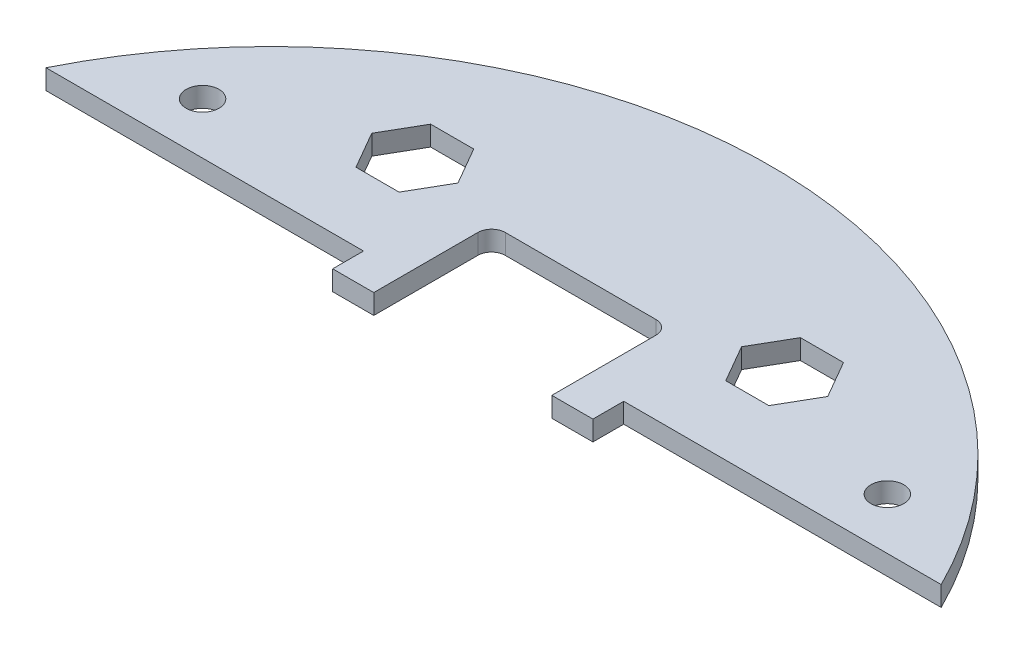
ISO-10303-21;
HEADER;
FILE_DESCRIPTION(('STEP AP214'),'2;1');
FILE_NAME('part.step','',(''),(''),'','','');
FILE_SCHEMA(('AUTOMOTIVE_DESIGN { 1 0 10303 214 1 1 1 1 }'));
ENDSEC;
DATA;
#1=APPLICATION_CONTEXT('core data for automotive mechanical design processes');
#2=APPLICATION_PROTOCOL_DEFINITION('international standard','automotive_design',2000,#1);
#3=PRODUCT_CONTEXT('',#1,'mechanical');
#4=PRODUCT('Part','Part','',(#3));
#5=PRODUCT_RELATED_PRODUCT_CATEGORY('part','',(#4));
#6=PRODUCT_DEFINITION_FORMATION('','',#4);
#7=PRODUCT_DEFINITION_CONTEXT('part definition',#1,'design');
#8=PRODUCT_DEFINITION('design','',#6,#7);
#9=PRODUCT_DEFINITION_SHAPE('','',#8);
#10=(LENGTH_UNIT() NAMED_UNIT(*) SI_UNIT(.MILLI.,.METRE.));
#11=(NAMED_UNIT(*) PLANE_ANGLE_UNIT() SI_UNIT($,.RADIAN.));
#12=(NAMED_UNIT(*) SI_UNIT($,.STERADIAN.) SOLID_ANGLE_UNIT());
#13=UNCERTAINTY_MEASURE_WITH_UNIT(LENGTH_MEASURE(1.E-05),#10,'distance_accuracy_value','');
#14=(GEOMETRIC_REPRESENTATION_CONTEXT(3) GLOBAL_UNCERTAINTY_ASSIGNED_CONTEXT((#13)) GLOBAL_UNIT_ASSIGNED_CONTEXT((#10,
#11,#12)) REPRESENTATION_CONTEXT('',''));
#15=CARTESIAN_POINT('',(0.,0.,0.));
#16=DIRECTION('',(0.,0.,1.));
#17=DIRECTION('',(1.,0.,0.));
#18=AXIS2_PLACEMENT_3D('',#15,#16,#17);
#19=CARTESIAN_POINT('',(-30.1465589670835,0.,-42.55));
#20=DIRECTION('',(0.,0.,1.));
#21=DIRECTION('',(1.,0.,0.));
#22=AXIS2_PLACEMENT_3D('',#19,#20,#21);
#23=PLANE('',#22);
#24=DIRECTION('',(1.,0.,0.));
#25=VECTOR('',#24,1.);
#26=CARTESIAN_POINT('',(-30.1465589670835,2.9,-42.55));
#27=LINE('',#26,#25);
#28=CARTESIAN_POINT('',(-30.1465589670835,2.9,-42.55));
#29=VERTEX_POINT('',#28);
#30=CARTESIAN_POINT('',(-23.8534410329165,2.9,-42.55));
#31=VERTEX_POINT('',#30);
#32=EDGE_CURVE('E301',#29,#31,#27,.T.);
#33=ORIENTED_EDGE('',*,*,#32,.T.);
#34=DIRECTION('',(0.,1.,0.));
#35=VECTOR('',#34,1.);
#36=CARTESIAN_POINT('',(-23.8534410329165,0.,-42.55));
#37=LINE('',#36,#35);
#38=CARTESIAN_POINT('',(-23.8534410329165,0.,-42.55));
#39=VERTEX_POINT('',#38);
#40=EDGE_CURVE('E332',#39,#31,#37,.T.);
#41=ORIENTED_EDGE('',*,*,#40,.F.);
#42=DIRECTION('',(1.,0.,0.));
#43=VECTOR('',#42,1.);
#44=CARTESIAN_POINT('',(-30.1465589670835,0.,-42.55));
#45=LINE('',#44,#43);
#46=CARTESIAN_POINT('',(-30.1465589670835,0.,-42.55));
#47=VERTEX_POINT('',#46);
#48=EDGE_CURVE('E313',#47,#39,#45,.T.);
#49=ORIENTED_EDGE('',*,*,#48,.F.);
#50=DIRECTION('',(0.,1.,0.));
#51=VECTOR('',#50,1.);
#52=CARTESIAN_POINT('',(-30.1465589670835,0.,-42.55));
#53=LINE('',#52,#51);
#54=EDGE_CURVE('E335',#47,#29,#53,.T.);
#55=ORIENTED_EDGE('',*,*,#54,.T.);
#56=EDGE_LOOP('',(#33,#41,#49,#55));
#57=FACE_BOUND('',#56,.T.);
#58=ADVANCED_FACE('F33',(#57),#23,.F.);
#59=CARTESIAN_POINT('',(-33.2931179341669,0.,-48.));
#60=DIRECTION('',(-0.866025403784439,0.,0.499999999999999));
#61=DIRECTION('',(0.499999999999999,0.,0.866025403784439));
#62=AXIS2_PLACEMENT_3D('',#59,#60,#61);
#63=PLANE('',#62);
#64=DIRECTION('',(0.499999999999999,0.,0.866025403784439));
#65=VECTOR('',#64,1.);
#66=CARTESIAN_POINT('',(-33.2931179341669,2.9,-48.));
#67=LINE('',#66,#65);
#68=CARTESIAN_POINT('',(-33.2931179341669,2.9,-48.));
#69=VERTEX_POINT('',#68);
#70=EDGE_CURVE('E327',#69,#29,#67,.T.);
#71=ORIENTED_EDGE('',*,*,#70,.T.);
#72=ORIENTED_EDGE('',*,*,#54,.F.);
#73=DIRECTION('',(0.499999999999999,0.,0.866025403784439));
#74=VECTOR('',#73,1.);
#75=CARTESIAN_POINT('',(-33.2931179341669,0.,-48.));
#76=LINE('',#75,#74);
#77=CARTESIAN_POINT('',(-33.2931179341669,0.,-48.));
#78=VERTEX_POINT('',#77);
#79=EDGE_CURVE('E310',#78,#47,#76,.T.);
#80=ORIENTED_EDGE('',*,*,#79,.F.);
#81=DIRECTION('',(0.,1.,0.));
#82=VECTOR('',#81,1.);
#83=CARTESIAN_POINT('',(-33.2931179341669,0.,-48.));
#84=LINE('',#83,#82);
#85=EDGE_CURVE('E337',#78,#69,#84,.T.);
#86=ORIENTED_EDGE('',*,*,#85,.T.);
#87=EDGE_LOOP('',(#71,#72,#80,#86));
#88=FACE_BOUND('',#87,.T.);
#89=ADVANCED_FACE('F444',(#88),#63,.F.);
#90=CARTESIAN_POINT('',(-30.1465589670834,0.,-53.45));
#91=DIRECTION('',(-0.866025403784439,0.,-0.5));
#92=DIRECTION('',(-0.5,0.,0.866025403784439));
#93=AXIS2_PLACEMENT_3D('',#90,#91,#92);
#94=PLANE('',#93);
#95=DIRECTION('',(-0.5,0.,0.866025403784439));
#96=VECTOR('',#95,1.);
#97=CARTESIAN_POINT('',(-30.1465589670834,2.9,-53.45));
#98=LINE('',#97,#96);
#99=CARTESIAN_POINT('',(-30.1465589670834,2.9,-53.45));
#100=VERTEX_POINT('',#99);
#101=EDGE_CURVE('E324',#100,#69,#98,.T.);
#102=ORIENTED_EDGE('',*,*,#101,.T.);
#103=ORIENTED_EDGE('',*,*,#85,.F.);
#104=DIRECTION('',(-0.5,0.,0.866025403784439));
#105=VECTOR('',#104,1.);
#106=CARTESIAN_POINT('',(-30.1465589670834,0.,-53.45));
#107=LINE('',#106,#105);
#108=CARTESIAN_POINT('',(-30.1465589670834,0.,-53.45));
#109=VERTEX_POINT('',#108);
#110=EDGE_CURVE('E307',#109,#78,#107,.T.);
#111=ORIENTED_EDGE('',*,*,#110,.F.);
#112=DIRECTION('',(0.,1.,0.));
#113=VECTOR('',#112,1.);
#114=CARTESIAN_POINT('',(-30.1465589670834,0.,-53.45));
#115=LINE('',#114,#113);
#116=EDGE_CURVE('E339',#109,#100,#115,.T.);
#117=ORIENTED_EDGE('',*,*,#116,.T.);
#118=EDGE_LOOP('',(#102,#103,#111,#117));
#119=FACE_BOUND('',#118,.T.);
#120=ADVANCED_FACE('F450',(#119),#94,.F.);
#121=CARTESIAN_POINT('',(-23.8534410329165,0.,-53.45));
#122=DIRECTION('',(0.,0.,-1.));
#123=DIRECTION('',(-1.,0.,0.));
#124=AXIS2_PLACEMENT_3D('',#121,#122,#123);
#125=PLANE('',#124);
#126=DIRECTION('',(-1.,0.,0.));
#127=VECTOR('',#126,1.);
#128=CARTESIAN_POINT('',(-23.8534410329165,2.9,-53.45));
#129=LINE('',#128,#127);
#130=CARTESIAN_POINT('',(-23.8534410329165,2.9,-53.45));
#131=VERTEX_POINT('',#130);
#132=EDGE_CURVE('E321',#131,#100,#129,.T.);
#133=ORIENTED_EDGE('',*,*,#132,.T.);
#134=ORIENTED_EDGE('',*,*,#116,.F.);
#135=DIRECTION('',(-1.,0.,0.));
#136=VECTOR('',#135,1.);
#137=CARTESIAN_POINT('',(-23.8534410329165,0.,-53.45));
#138=LINE('',#137,#136);
#139=CARTESIAN_POINT('',(-23.8534410329165,0.,-53.45));
#140=VERTEX_POINT('',#139);
#141=EDGE_CURVE('E304',#140,#109,#138,.T.);
#142=ORIENTED_EDGE('',*,*,#141,.F.);
#143=DIRECTION('',(0.,1.,0.));
#144=VECTOR('',#143,1.);
#145=CARTESIAN_POINT('',(-23.8534410329165,0.,-53.45));
#146=LINE('',#145,#144);
#147=EDGE_CURVE('E341',#140,#131,#146,.T.);
#148=ORIENTED_EDGE('',*,*,#147,.T.);
#149=EDGE_LOOP('',(#133,#134,#142,#148));
#150=FACE_BOUND('',#149,.T.);
#151=ADVANCED_FACE('F459',(#150),#125,.F.);
#152=CARTESIAN_POINT('',(-20.7068820658331,0.,-48.));
#153=DIRECTION('',(0.866025403784439,0.,-0.5));
#154=DIRECTION('',(-0.5,0.,-0.866025403784439));
#155=AXIS2_PLACEMENT_3D('',#152,#153,#154);
#156=PLANE('',#155);
#157=DIRECTION('',(-0.5,0.,-0.866025403784439));
#158=VECTOR('',#157,1.);
#159=CARTESIAN_POINT('',(-20.7068820658331,2.9,-48.));
#160=LINE('',#159,#158);
#161=CARTESIAN_POINT('',(-20.7068820658331,2.9,-48.));
#162=VERTEX_POINT('',#161);
#163=EDGE_CURVE('E318',#162,#131,#160,.T.);
#164=ORIENTED_EDGE('',*,*,#163,.T.);
#165=ORIENTED_EDGE('',*,*,#147,.F.);
#166=DIRECTION('',(-0.5,0.,-0.866025403784439));
#167=VECTOR('',#166,1.);
#168=CARTESIAN_POINT('',(-20.7068820658331,0.,-48.));
#169=LINE('',#168,#167);
#170=CARTESIAN_POINT('',(-20.7068820658331,0.,-48.));
#171=VERTEX_POINT('',#170);
#172=EDGE_CURVE('E300',#171,#140,#169,.T.);
#173=ORIENTED_EDGE('',*,*,#172,.F.);
#174=DIRECTION('',(0.,1.,0.));
#175=VECTOR('',#174,1.);
#176=CARTESIAN_POINT('',(-20.7068820658331,0.,-48.));
#177=LINE('',#176,#175);
#178=EDGE_CURVE('E316',#171,#162,#177,.T.);
#179=ORIENTED_EDGE('',*,*,#178,.T.);
#180=EDGE_LOOP('',(#164,#165,#173,#179));
#181=FACE_BOUND('',#180,.T.);
#182=ADVANCED_FACE('F463',(#181),#156,.F.);
#183=CARTESIAN_POINT('',(-23.8534410329165,0.,-42.55));
#184=DIRECTION('',(0.866025403784439,0.,0.5));
#185=DIRECTION('',(0.5,0.,-0.866025403784439));
#186=AXIS2_PLACEMENT_3D('',#183,#184,#185);
#187=PLANE('',#186);
#188=DIRECTION('',(0.5,0.,-0.866025403784439));
#189=VECTOR('',#188,1.);
#190=CARTESIAN_POINT('',(-23.8534410329165,2.9,-42.55));
#191=LINE('',#190,#189);
#192=EDGE_CURVE('E287',#31,#162,#191,.T.);
#193=ORIENTED_EDGE('',*,*,#192,.T.);
#194=ORIENTED_EDGE('',*,*,#178,.F.);
#195=DIRECTION('',(0.5,0.,-0.866025403784439));
#196=VECTOR('',#195,1.);
#197=CARTESIAN_POINT('',(-23.8534410329165,0.,-42.55));
#198=LINE('',#197,#196);
#199=EDGE_CURVE('E297',#39,#171,#198,.T.);
#200=ORIENTED_EDGE('',*,*,#199,.F.);
#201=ORIENTED_EDGE('',*,*,#40,.T.);
#202=EDGE_LOOP('',(#193,#194,#200,#201));
#203=FACE_BOUND('',#202,.T.);
#204=ADVANCED_FACE('F467',(#203),#187,.F.);
#205=CARTESIAN_POINT('',(23.8534410329165,0.,-42.55));
#206=DIRECTION('',(-0.866025403784439,0.,0.5));
#207=DIRECTION('',(0.5,0.,0.866025403784439));
#208=AXIS2_PLACEMENT_3D('',#205,#206,#207);
#209=PLANE('',#208);
#210=DIRECTION('',(0.5,0.,0.866025403784439));
#211=VECTOR('',#210,1.);
#212=CARTESIAN_POINT('',(23.8534410329165,2.9,-42.55));
#213=LINE('',#212,#211);
#214=CARTESIAN_POINT('',(20.7068820658331,2.9,-48.));
#215=VERTEX_POINT('',#214);
#216=CARTESIAN_POINT('',(23.8534410329165,2.9,-42.55));
#217=VERTEX_POINT('',#216);
#218=EDGE_CURVE('E256',#215,#217,#213,.T.);
#219=ORIENTED_EDGE('',*,*,#218,.T.);
#220=DIRECTION('',(0.,1.,0.));
#221=VECTOR('',#220,1.);
#222=CARTESIAN_POINT('',(23.8534410329165,0.,-42.55));
#223=LINE('',#222,#221);
#224=CARTESIAN_POINT('',(23.8534410329165,0.,-42.55));
#225=VERTEX_POINT('',#224);
#226=EDGE_CURVE('E285',#225,#217,#223,.T.);
#227=ORIENTED_EDGE('',*,*,#226,.F.);
#228=DIRECTION('',(0.5,0.,0.866025403784439));
#229=VECTOR('',#228,1.);
#230=CARTESIAN_POINT('',(23.8534410329165,0.,-42.55));
#231=LINE('',#230,#229);
#232=CARTESIAN_POINT('',(20.7068820658331,0.,-48.));
#233=VERTEX_POINT('',#232);
#234=EDGE_CURVE('E266',#233,#225,#231,.T.);
#235=ORIENTED_EDGE('',*,*,#234,.F.);
#236=DIRECTION('',(0.,1.,0.));
#237=VECTOR('',#236,1.);
#238=CARTESIAN_POINT('',(20.7068820658331,0.,-48.));
#239=LINE('',#238,#237);
#240=EDGE_CURVE('E288',#233,#215,#239,.T.);
#241=ORIENTED_EDGE('',*,*,#240,.T.);
#242=EDGE_LOOP('',(#219,#227,#235,#241));
#243=FACE_BOUND('',#242,.T.);
#244=ADVANCED_FACE('F471',(#243),#209,.F.);
#245=CARTESIAN_POINT('',(20.7068820658331,0.,-48.));
#246=DIRECTION('',(-0.866025403784439,0.,-0.5));
#247=DIRECTION('',(-0.5,0.,0.866025403784439));
#248=AXIS2_PLACEMENT_3D('',#245,#246,#247);
#249=PLANE('',#248);
#250=DIRECTION('',(-0.5,0.,0.866025403784439));
#251=VECTOR('',#250,1.);
#252=CARTESIAN_POINT('',(20.7068820658331,2.9,-48.));
#253=LINE('',#252,#251);
#254=CARTESIAN_POINT('',(23.8534410329165,2.9,-53.45));
#255=VERTEX_POINT('',#254);
#256=EDGE_CURVE('E280',#255,#215,#253,.T.);
#257=ORIENTED_EDGE('',*,*,#256,.T.);
#258=ORIENTED_EDGE('',*,*,#240,.F.);
#259=DIRECTION('',(-0.5,0.,0.866025403784439));
#260=VECTOR('',#259,1.);
#261=CARTESIAN_POINT('',(20.7068820658331,0.,-48.));
#262=LINE('',#261,#260);
#263=CARTESIAN_POINT('',(23.8534410329165,0.,-53.45));
#264=VERTEX_POINT('',#263);
#265=EDGE_CURVE('E263',#264,#233,#262,.T.);
#266=ORIENTED_EDGE('',*,*,#265,.F.);
#267=DIRECTION('',(0.,1.,0.));
#268=VECTOR('',#267,1.);
#269=CARTESIAN_POINT('',(23.8534410329165,0.,-53.45));
#270=LINE('',#269,#268);
#271=EDGE_CURVE('E290',#264,#255,#270,.T.);
#272=ORIENTED_EDGE('',*,*,#271,.T.);
#273=EDGE_LOOP('',(#257,#258,#266,#272));
#274=FACE_BOUND('',#273,.T.);
#275=ADVANCED_FACE('F545',(#274),#249,.F.);
#276=CARTESIAN_POINT('',(23.8534410329165,0.,-53.45));
#277=DIRECTION('',(0.,0.,-1.));
#278=DIRECTION('',(-1.,0.,0.));
#279=AXIS2_PLACEMENT_3D('',#276,#277,#278);
#280=PLANE('',#279);
#281=DIRECTION('',(-1.,0.,0.));
#282=VECTOR('',#281,1.);
#283=CARTESIAN_POINT('',(23.8534410329165,2.9,-53.45));
#284=LINE('',#283,#282);
#285=CARTESIAN_POINT('',(30.1465589670834,2.9,-53.45));
#286=VERTEX_POINT('',#285);
#287=EDGE_CURVE('E277',#286,#255,#284,.T.);
#288=ORIENTED_EDGE('',*,*,#287,.T.);
#289=ORIENTED_EDGE('',*,*,#271,.F.);
#290=DIRECTION('',(-1.,0.,0.));
#291=VECTOR('',#290,1.);
#292=CARTESIAN_POINT('',(23.8534410329165,0.,-53.45));
#293=LINE('',#292,#291);
#294=CARTESIAN_POINT('',(30.1465589670834,0.,-53.45));
#295=VERTEX_POINT('',#294);
#296=EDGE_CURVE('E260',#295,#264,#293,.T.);
#297=ORIENTED_EDGE('',*,*,#296,.F.);
#298=DIRECTION('',(0.,1.,0.));
#299=VECTOR('',#298,1.);
#300=CARTESIAN_POINT('',(30.1465589670834,0.,-53.45));
#301=LINE('',#300,#299);
#302=EDGE_CURVE('E292',#295,#286,#301,.T.);
#303=ORIENTED_EDGE('',*,*,#302,.T.);
#304=EDGE_LOOP('',(#288,#289,#297,#303));
#305=FACE_BOUND('',#304,.T.);
#306=ADVANCED_FACE('F549',(#305),#280,.F.);
#307=CARTESIAN_POINT('',(30.1465589670834,0.,-53.45));
#308=DIRECTION('',(0.866025403784439,0.,-0.5));
#309=DIRECTION('',(-0.5,0.,-0.866025403784439));
#310=AXIS2_PLACEMENT_3D('',#307,#308,#309);
#311=PLANE('',#310);
#312=DIRECTION('',(-0.5,0.,-0.866025403784439));
#313=VECTOR('',#312,1.);
#314=CARTESIAN_POINT('',(30.1465589670834,2.9,-53.45));
#315=LINE('',#314,#313);
#316=CARTESIAN_POINT('',(33.2931179341669,2.9,-48.));
#317=VERTEX_POINT('',#316);
#318=EDGE_CURVE('E274',#317,#286,#315,.T.);
#319=ORIENTED_EDGE('',*,*,#318,.T.);
#320=ORIENTED_EDGE('',*,*,#302,.F.);
#321=DIRECTION('',(-0.5,0.,-0.866025403784439));
#322=VECTOR('',#321,1.);
#323=CARTESIAN_POINT('',(30.1465589670834,0.,-53.45));
#324=LINE('',#323,#322);
#325=CARTESIAN_POINT('',(33.2931179341669,0.,-48.));
#326=VERTEX_POINT('',#325);
#327=EDGE_CURVE('E56',#326,#295,#324,.T.);
#328=ORIENTED_EDGE('',*,*,#327,.F.);
#329=DIRECTION('',(0.,1.,0.));
#330=VECTOR('',#329,1.);
#331=CARTESIAN_POINT('',(33.2931179341669,0.,-48.));
#332=LINE('',#331,#330);
#333=EDGE_CURVE('E294',#326,#317,#332,.T.);
#334=ORIENTED_EDGE('',*,*,#333,.T.);
#335=EDGE_LOOP('',(#319,#320,#328,#334));
#336=FACE_BOUND('',#335,.T.);
#337=ADVANCED_FACE('F553',(#336),#311,.F.);
#338=CARTESIAN_POINT('',(33.2931179341669,0.,-48.));
#339=DIRECTION('',(0.866025403784439,0.,0.499999999999999));
#340=DIRECTION('',(0.499999999999999,0.,-0.866025403784439));
#341=AXIS2_PLACEMENT_3D('',#338,#339,#340);
#342=PLANE('',#341);
#343=DIRECTION('',(0.499999999999999,0.,-0.866025403784439));
#344=VECTOR('',#343,1.);
#345=CARTESIAN_POINT('',(33.2931179341669,2.9,-48.));
#346=LINE('',#345,#344);
#347=CARTESIAN_POINT('',(30.1465589670834,2.9,-42.55));
#348=VERTEX_POINT('',#347);
#349=EDGE_CURVE('E271',#348,#317,#346,.T.);
#350=ORIENTED_EDGE('',*,*,#349,.T.);
#351=ORIENTED_EDGE('',*,*,#333,.F.);
#352=DIRECTION('',(0.499999999999999,0.,-0.866025403784439));
#353=VECTOR('',#352,1.);
#354=CARTESIAN_POINT('',(33.2931179341669,0.,-48.));
#355=LINE('',#354,#353);
#356=CARTESIAN_POINT('',(30.1465589670835,0.,-42.55));
#357=VERTEX_POINT('',#356);
#358=EDGE_CURVE('E255',#357,#326,#355,.T.);
#359=ORIENTED_EDGE('',*,*,#358,.F.);
#360=DIRECTION('',(0.,1.,0.));
#361=VECTOR('',#360,1.);
#362=CARTESIAN_POINT('',(30.1465589670835,0.,-42.55));
#363=LINE('',#362,#361);
#364=EDGE_CURVE('E269',#357,#348,#363,.T.);
#365=ORIENTED_EDGE('',*,*,#364,.T.);
#366=EDGE_LOOP('',(#350,#351,#359,#365));
#367=FACE_BOUND('',#366,.T.);
#368=ADVANCED_FACE('F556',(#367),#342,.F.);
#369=CARTESIAN_POINT('',(30.1465589670835,0.,-42.55));
#370=DIRECTION('',(0.,0.,1.));
#371=DIRECTION('',(1.,0.,0.));
#372=AXIS2_PLACEMENT_3D('',#369,#370,#371);
#373=PLANE('',#372);
#374=DIRECTION('',(1.,0.,0.));
#375=VECTOR('',#374,1.);
#376=CARTESIAN_POINT('',(30.1465589670835,2.9,-42.55));
#377=LINE('',#376,#375);
#378=EDGE_CURVE('E48',#217,#348,#377,.T.);
#379=ORIENTED_EDGE('',*,*,#378,.T.);
#380=ORIENTED_EDGE('',*,*,#364,.F.);
#381=DIRECTION('',(1.,0.,0.));
#382=VECTOR('',#381,1.);
#383=CARTESIAN_POINT('',(30.1465589670835,0.,-42.55));
#384=LINE('',#383,#382);
#385=EDGE_CURVE('E252',#225,#357,#384,.T.);
#386=ORIENTED_EDGE('',*,*,#385,.F.);
#387=ORIENTED_EDGE('',*,*,#226,.T.);
#388=EDGE_LOOP('',(#379,#380,#386,#387));
#389=FACE_BOUND('',#388,.T.);
#390=ADVANCED_FACE('F454',(#389),#373,.F.);
#391=CARTESIAN_POINT('',(50.,0.,-40.));
#392=DIRECTION('',(0.,1.,0.));
#393=DIRECTION('',(0.,0.,1.));
#394=AXIS2_PLACEMENT_3D('',#391,#392,#393);
#395=CYLINDRICAL_SURFACE('',#394,2.4);
#396=CARTESIAN_POINT('',(50.,0.,-40.));
#397=DIRECTION('',(0.,1.,0.));
#398=DIRECTION('',(0.,0.,1.));
#399=AXIS2_PLACEMENT_3D('',#396,#397,#398);
#400=CIRCLE('',#399,2.4);
#401=CARTESIAN_POINT('',(50.,0.,-37.6));
#402=VERTEX_POINT('',#401);
#403=EDGE_CURVE('E247',#402,#402,#400,.T.);
#404=ORIENTED_EDGE('',*,*,#403,.F.);
#405=EDGE_LOOP('',(#404));
#406=FACE_BOUND('',#405,.T.);
#407=CARTESIAN_POINT('',(50.,2.9,-40.));
#408=DIRECTION('',(0.,1.,0.));
#409=DIRECTION('',(0.,0.,1.));
#410=AXIS2_PLACEMENT_3D('',#407,#408,#409);
#411=CIRCLE('',#410,2.4);
#412=CARTESIAN_POINT('',(50.,2.9,-37.6));
#413=VERTEX_POINT('',#412);
#414=EDGE_CURVE('E240',#413,#413,#411,.T.);
#415=ORIENTED_EDGE('',*,*,#414,.T.);
#416=EDGE_LOOP('',(#415));
#417=FACE_BOUND('',#416,.T.);
#418=ADVANCED_FACE('F538',(#406,#417),#395,.F.);
#419=CARTESIAN_POINT('',(-50.,0.,-40.));
#420=DIRECTION('',(0.,1.,0.));
#421=DIRECTION('',(0.,0.,1.));
#422=AXIS2_PLACEMENT_3D('',#419,#420,#421);
#423=CYLINDRICAL_SURFACE('',#422,2.4);
#424=CARTESIAN_POINT('',(-50.,0.,-40.));
#425=DIRECTION('',(0.,1.,0.));
#426=DIRECTION('',(0.,0.,1.));
#427=AXIS2_PLACEMENT_3D('',#424,#425,#426);
#428=CIRCLE('',#427,2.4);
#429=CARTESIAN_POINT('',(-50.,0.,-37.6));
#430=VERTEX_POINT('',#429);
#431=EDGE_CURVE('E241',#430,#430,#428,.T.);
#432=ORIENTED_EDGE('',*,*,#431,.F.);
#433=EDGE_LOOP('',(#432));
#434=FACE_BOUND('',#433,.T.);
#435=CARTESIAN_POINT('',(-50.,2.9,-40.));
#436=DIRECTION('',(0.,1.,0.));
#437=DIRECTION('',(0.,0.,1.));
#438=AXIS2_PLACEMENT_3D('',#435,#436,#437);
#439=CIRCLE('',#438,2.4);
#440=CARTESIAN_POINT('',(-50.,2.9,-37.6));
#441=VERTEX_POINT('',#440);
#442=EDGE_CURVE('E244',#441,#441,#439,.T.);
#443=ORIENTED_EDGE('',*,*,#442,.T.);
#444=EDGE_LOOP('',(#443));
#445=FACE_BOUND('',#444,.T.);
#446=ADVANCED_FACE('F475',(#434,#445),#423,.F.);
#447=CARTESIAN_POINT('',(-10.9999999999999,0.,-43.2));
#448=DIRECTION('',(0.,1.,0.));
#449=DIRECTION('',(0.,0.,1.));
#450=AXIS2_PLACEMENT_3D('',#447,#448,#449);
#451=CYLINDRICAL_SURFACE('',#450,2.);
#452=CARTESIAN_POINT('',(-10.9999999999999,2.9,-43.2));
#453=DIRECTION('',(0.,1.,0.));
#454=DIRECTION('',(0.,0.,1.));
#455=AXIS2_PLACEMENT_3D('',#452,#453,#454);
#456=CIRCLE('',#455,2.);
#457=CARTESIAN_POINT('',(-10.9999999999999,2.9,-45.2));
#458=VERTEX_POINT('',#457);
#459=CARTESIAN_POINT('',(-12.9999999999999,2.9,-43.2));
#460=VERTEX_POINT('',#459);
#461=EDGE_CURVE('E349',#458,#460,#456,.T.);
#462=ORIENTED_EDGE('',*,*,#461,.T.);
#463=DIRECTION('',(0.,1.,0.));
#464=VECTOR('',#463,1.);
#465=CARTESIAN_POINT('',(-12.9999999999999,0.,-43.2));
#466=LINE('',#465,#464);
#467=CARTESIAN_POINT('',(-12.9999999999999,0.,-43.2));
#468=VERTEX_POINT('',#467);
#469=EDGE_CURVE('E374',#468,#460,#466,.T.);
#470=ORIENTED_EDGE('',*,*,#469,.F.);
#471=CARTESIAN_POINT('',(-10.9999999999999,0.,-43.2));
#472=DIRECTION('',(0.,1.,0.));
#473=DIRECTION('',(0.,0.,1.));
#474=AXIS2_PLACEMENT_3D('',#471,#472,#473);
#475=CIRCLE('',#474,2.);
#476=CARTESIAN_POINT('',(-10.9999999999999,0.,-45.2));
#477=VERTEX_POINT('',#476);
#478=EDGE_CURVE('E358',#477,#468,#475,.T.);
#479=ORIENTED_EDGE('',*,*,#478,.F.);
#480=DIRECTION('',(0.,1.,0.));
#481=VECTOR('',#480,1.);
#482=CARTESIAN_POINT('',(-10.9999999999999,0.,-45.2));
#483=LINE('',#482,#481);
#484=EDGE_CURVE('E377',#477,#458,#483,.T.);
#485=ORIENTED_EDGE('',*,*,#484,.T.);
#486=EDGE_LOOP('',(#462,#470,#479,#485));
#487=FACE_BOUND('',#486,.T.);
#488=ADVANCED_FACE('F415',(#487),#451,.F.);
#489=CARTESIAN_POINT('',(10.9999999999999,0.,-45.2));
#490=DIRECTION('',(0.,0.,-1.));
#491=DIRECTION('',(-1.,0.,0.));
#492=AXIS2_PLACEMENT_3D('',#489,#490,#491);
#493=PLANE('',#492);
#494=DIRECTION('',(-1.,0.,0.));
#495=VECTOR('',#494,1.);
#496=CARTESIAN_POINT('',(10.9999999999999,2.9,-45.2));
#497=LINE('',#496,#495);
#498=CARTESIAN_POINT('',(10.9999999999999,2.9,-45.2));
#499=VERTEX_POINT('',#498);
#500=EDGE_CURVE('E369',#499,#458,#497,.T.);
#501=ORIENTED_EDGE('',*,*,#500,.T.);
#502=ORIENTED_EDGE('',*,*,#484,.F.);
#503=DIRECTION('',(-1.,0.,0.));
#504=VECTOR('',#503,1.);
#505=CARTESIAN_POINT('',(10.9999999999999,0.,-45.2));
#506=LINE('',#505,#504);
#507=CARTESIAN_POINT('',(10.9999999999999,0.,-45.2));
#508=VERTEX_POINT('',#507);
#509=EDGE_CURVE('E355',#508,#477,#506,.T.);
#510=ORIENTED_EDGE('',*,*,#509,.F.);
#511=DIRECTION('',(0.,1.,0.));
#512=VECTOR('',#511,1.);
#513=CARTESIAN_POINT('',(10.9999999999999,0.,-45.2));
#514=LINE('',#513,#512);
#515=EDGE_CURVE('E379',#508,#499,#514,.T.);
#516=ORIENTED_EDGE('',*,*,#515,.T.);
#517=EDGE_LOOP('',(#501,#502,#510,#516));
#518=FACE_BOUND('',#517,.T.);
#519=ADVANCED_FACE('F411',(#518),#493,.F.);
#520=CARTESIAN_POINT('',(10.9999999999999,0.,-43.2));
#521=DIRECTION('',(0.,1.,0.));
#522=DIRECTION('',(0.,0.,1.));
#523=AXIS2_PLACEMENT_3D('',#520,#521,#522);
#524=CYLINDRICAL_SURFACE('',#523,2.);
#525=CARTESIAN_POINT('',(10.9999999999999,2.9,-43.2));
#526=DIRECTION('',(0.,1.,0.));
#527=DIRECTION('',(0.,0.,1.));
#528=AXIS2_PLACEMENT_3D('',#525,#526,#527);
#529=CIRCLE('',#528,2.);
#530=CARTESIAN_POINT('',(12.9999999999999,2.9,-43.2));
#531=VERTEX_POINT('',#530);
#532=EDGE_CURVE('E366',#531,#499,#529,.T.);
#533=ORIENTED_EDGE('',*,*,#532,.T.);
#534=ORIENTED_EDGE('',*,*,#515,.F.);
#535=CARTESIAN_POINT('',(10.9999999999999,0.,-43.2));
#536=DIRECTION('',(0.,1.,0.));
#537=DIRECTION('',(0.,0.,1.));
#538=AXIS2_PLACEMENT_3D('',#535,#536,#537);
#539=CIRCLE('',#538,2.);
#540=CARTESIAN_POINT('',(12.9999999999999,0.,-43.2));
#541=VERTEX_POINT('',#540);
#542=EDGE_CURVE('E352',#541,#508,#539,.T.);
#543=ORIENTED_EDGE('',*,*,#542,.F.);
#544=DIRECTION('',(0.,1.,0.));
#545=VECTOR('',#544,1.);
#546=CARTESIAN_POINT('',(12.9999999999999,0.,-43.2));
#547=LINE('',#546,#545);
#548=EDGE_CURVE('E381',#541,#531,#547,.T.);
#549=ORIENTED_EDGE('',*,*,#548,.T.);
#550=EDGE_LOOP('',(#533,#534,#543,#549));
#551=FACE_BOUND('',#550,.T.);
#552=ADVANCED_FACE('F409',(#551),#524,.F.);
#553=CARTESIAN_POINT('',(-12.9999999999999,0.,-43.2));
#554=DIRECTION('',(-1.,0.,0.));
#555=DIRECTION('',(0.,0.,1.));
#556=AXIS2_PLACEMENT_3D('',#553,#554,#555);
#557=PLANE('',#556);
#558=DIRECTION('',(0.,0.,1.));
#559=VECTOR('',#558,1.);
#560=CARTESIAN_POINT('',(-12.9999999999999,2.9,-43.2));
#561=LINE('',#560,#559);
#562=CARTESIAN_POINT('',(-13.,2.9,-28.));
#563=VERTEX_POINT('',#562);
#564=EDGE_CURVE('E334',#460,#563,#561,.T.);
#565=ORIENTED_EDGE('',*,*,#564,.T.);
#566=DIRECTION('',(0.,1.,0.));
#567=VECTOR('',#566,1.);
#568=CARTESIAN_POINT('',(-13.,0.,-28.));
#569=LINE('',#568,#567);
#570=CARTESIAN_POINT('',(-13.,0.,-28.));
#571=VERTEX_POINT('',#570);
#572=EDGE_CURVE('E361',#571,#563,#569,.T.);
#573=ORIENTED_EDGE('',*,*,#572,.F.);
#574=DIRECTION('',(0.,0.,1.));
#575=VECTOR('',#574,1.);
#576=CARTESIAN_POINT('',(-12.9999999999999,0.,-43.2));
#577=LINE('',#576,#575);
#578=EDGE_CURVE('E345',#468,#571,#577,.T.);
#579=ORIENTED_EDGE('',*,*,#578,.F.);
#580=ORIENTED_EDGE('',*,*,#469,.T.);
#581=EDGE_LOOP('',(#565,#573,#579,#580));
#582=FACE_BOUND('',#581,.T.);
#583=ADVANCED_FACE('F480',(#582),#557,.F.);
#584=CARTESIAN_POINT('',(13.,0.,-28.));
#585=DIRECTION('',(1.,0.,0.));
#586=DIRECTION('',(0.,0.,-1.));
#587=AXIS2_PLACEMENT_3D('',#584,#585,#586);
#588=PLANE('',#587);
#589=DIRECTION('',(0.,0.,-1.));
#590=VECTOR('',#589,1.);
#591=CARTESIAN_POINT('',(13.,2.9,-28.));
#592=LINE('',#591,#590);
#593=CARTESIAN_POINT('',(13.,2.9,-28.));
#594=VERTEX_POINT('',#593);
#595=EDGE_CURVE('E363',#594,#531,#592,.T.);
#596=ORIENTED_EDGE('',*,*,#595,.T.);
#597=ORIENTED_EDGE('',*,*,#548,.F.);
#598=DIRECTION('',(0.,0.,-1.));
#599=VECTOR('',#598,1.);
#600=CARTESIAN_POINT('',(13.,0.,-28.));
#601=LINE('',#600,#599);
#602=CARTESIAN_POINT('',(13.,0.,-28.));
#603=VERTEX_POINT('',#602);
#604=EDGE_CURVE('E348',#603,#541,#601,.T.);
#605=ORIENTED_EDGE('',*,*,#604,.F.);
#606=DIRECTION('',(0.,1.,0.));
#607=VECTOR('',#606,1.);
#608=CARTESIAN_POINT('',(13.,0.,-28.));
#609=LINE('',#608,#607);
#610=EDGE_CURVE('E383',#603,#594,#609,.T.);
#611=ORIENTED_EDGE('',*,*,#610,.T.);
#612=EDGE_LOOP('',(#596,#597,#605,#611));
#613=FACE_BOUND('',#612,.T.);
#614=ADVANCED_FACE('F405',(#613),#588,.F.);
#615=CARTESIAN_POINT('',(19.,0.,-28.));
#616=DIRECTION('',(0.,0.,-1.));
#617=DIRECTION('',(-1.,0.,0.));
#618=AXIS2_PLACEMENT_3D('',#615,#616,#617);
#619=PLANE('',#618);
#620=DIRECTION('',(-1.,0.,0.));
#621=VECTOR('',#620,1.);
#622=CARTESIAN_POINT('',(19.,0.,-28.));
#623=LINE('',#622,#621);
#624=CARTESIAN_POINT('',(-19.,0.,-28.));
#625=VERTEX_POINT('',#624);
#626=EDGE_CURVE('E389',#571,#625,#623,.T.);
#627=ORIENTED_EDGE('',*,*,#626,.F.);
#628=ORIENTED_EDGE('',*,*,#572,.T.);
#629=DIRECTION('',(-1.,0.,0.));
#630=VECTOR('',#629,1.);
#631=CARTESIAN_POINT('',(19.,2.9,-28.));
#632=LINE('',#631,#630);
#633=CARTESIAN_POINT('',(-19.,2.9,-28.));
#634=VERTEX_POINT('',#633);
#635=EDGE_CURVE('E376',#563,#634,#632,.T.);
#636=ORIENTED_EDGE('',*,*,#635,.T.);
#637=DIRECTION('',(0.,1.,0.));
#638=VECTOR('',#637,1.);
#639=CARTESIAN_POINT('',(-19.,0.,-28.));
#640=LINE('',#639,#638);
#641=EDGE_CURVE('E393',#625,#634,#640,.T.);
#642=ORIENTED_EDGE('',*,*,#641,.F.);
#643=EDGE_LOOP('',(#627,#628,#636,#642));
#644=FACE_BOUND('',#643,.T.);
#645=ADVANCED_FACE('F422',(#644),#619,.F.);
#646=CARTESIAN_POINT('',(19.,2.9,-28.));
#647=VERTEX_POINT('',#646);
#648=EDGE_CURVE('E390',#647,#594,#632,.T.);
#649=ORIENTED_EDGE('',*,*,#648,.T.);
#650=ORIENTED_EDGE('',*,*,#610,.F.);
#651=CARTESIAN_POINT('',(19.,0.,-28.));
#652=VERTEX_POINT('',#651);
#653=EDGE_CURVE('E387',#652,#603,#623,.T.);
#654=ORIENTED_EDGE('',*,*,#653,.F.);
#655=DIRECTION('',(0.,1.,0.));
#656=VECTOR('',#655,1.);
#657=CARTESIAN_POINT('',(19.,0.,-28.));
#658=LINE('',#657,#656);
#659=EDGE_CURVE('E210',#652,#647,#658,.T.);
#660=ORIENTED_EDGE('',*,*,#659,.T.);
#661=EDGE_LOOP('',(#649,#650,#654,#660));
#662=FACE_BOUND('',#661,.T.);
#663=ADVANCED_FACE('F397',(#662),#619,.F.);
#664=CARTESIAN_POINT('',(17.1660889906091,0.,71.8483455882353));
#665=DIRECTION('',(0.,-1.,0.));
#666=DIRECTION('',(0.,0.,-1.));
#667=AXIS2_PLACEMENT_3D('',#664,#665,#666);
#668=PLANE('',#667);
#669=DIRECTION('',(-1.,0.,0.));
#670=VECTOR('',#669,1.);
#671=CARTESIAN_POINT('',(-73.,0.,-32.5));
#672=LINE('',#671,#670);
#673=CARTESIAN_POINT('',(-19.,0.,-32.5));
#674=VERTEX_POINT('',#673);
#675=CARTESIAN_POINT('',(-65.3662757085028,0.,-32.5));
#676=VERTEX_POINT('',#675);
#677=EDGE_CURVE('E204',#674,#676,#672,.T.);
#678=ORIENTED_EDGE('',*,*,#677,.T.);
#679=CARTESIAN_POINT('',(0.,0.,0.));
#680=DIRECTION('',(0.,1.,0.));
#681=DIRECTION('',(0.,0.,1.));
#682=AXIS2_PLACEMENT_3D('',#679,#680,#681);
#683=CIRCLE('',#682,73.);
#684=CARTESIAN_POINT('',(65.3662757085028,0.,-32.5));
#685=VERTEX_POINT('',#684);
#686=EDGE_CURVE('E37',#685,#676,#683,.T.);
#687=ORIENTED_EDGE('',*,*,#686,.F.);
#688=DIRECTION('',(-1.,0.,0.));
#689=VECTOR('',#688,1.);
#690=CARTESIAN_POINT('',(19.,0.,-32.5));
#691=LINE('',#690,#689);
#692=CARTESIAN_POINT('',(19.,0.,-32.5));
#693=VERTEX_POINT('',#692);
#694=EDGE_CURVE('E197',#685,#693,#691,.T.);
#695=ORIENTED_EDGE('',*,*,#694,.T.);
#696=DIRECTION('',(0.,0.,1.));
#697=VECTOR('',#696,1.);
#698=CARTESIAN_POINT('',(19.,0.,-28.));
#699=LINE('',#698,#697);
#700=EDGE_CURVE('E207',#693,#652,#699,.T.);
#701=ORIENTED_EDGE('',*,*,#700,.T.);
#702=ORIENTED_EDGE('',*,*,#653,.T.);
#703=ORIENTED_EDGE('',*,*,#604,.T.);
#704=ORIENTED_EDGE('',*,*,#542,.T.);
#705=ORIENTED_EDGE('',*,*,#509,.T.);
#706=ORIENTED_EDGE('',*,*,#478,.T.);
#707=ORIENTED_EDGE('',*,*,#578,.T.);
#708=ORIENTED_EDGE('',*,*,#626,.T.);
#709=DIRECTION('',(0.,0.,-1.));
#710=VECTOR('',#709,1.);
#711=CARTESIAN_POINT('',(-19.,0.,-28.));
#712=LINE('',#711,#710);
#713=EDGE_CURVE('E214',#625,#674,#712,.T.);
#714=ORIENTED_EDGE('',*,*,#713,.T.);
#715=EDGE_LOOP('',(#678,#687,#695,#701,#702,#703,#704,#705,#706,#707,#708,#714));
#716=FACE_BOUND('',#715,.T.);
#717=ORIENTED_EDGE('',*,*,#431,.T.);
#718=EDGE_LOOP('',(#717));
#719=FACE_BOUND('',#718,.T.);
#720=ORIENTED_EDGE('',*,*,#403,.T.);
#721=EDGE_LOOP('',(#720));
#722=FACE_BOUND('',#721,.T.);
#723=ORIENTED_EDGE('',*,*,#385,.T.);
#724=ORIENTED_EDGE('',*,*,#358,.T.);
#725=ORIENTED_EDGE('',*,*,#327,.T.);
#726=ORIENTED_EDGE('',*,*,#296,.T.);
#727=ORIENTED_EDGE('',*,*,#265,.T.);
#728=ORIENTED_EDGE('',*,*,#234,.T.);
#729=EDGE_LOOP('',(#723,#724,#725,#726,#727,#728));
#730=FACE_BOUND('',#729,.T.);
#731=ORIENTED_EDGE('',*,*,#199,.T.);
#732=ORIENTED_EDGE('',*,*,#172,.T.);
#733=ORIENTED_EDGE('',*,*,#141,.T.);
#734=ORIENTED_EDGE('',*,*,#110,.T.);
#735=ORIENTED_EDGE('',*,*,#79,.T.);
#736=ORIENTED_EDGE('',*,*,#48,.T.);
#737=EDGE_LOOP('',(#731,#732,#733,#734,#735,#736));
#738=FACE_BOUND('',#737,.T.);
#739=ADVANCED_FACE('F218',(#716,#719,#722,#730,#738),#668,.T.);
#740=CARTESIAN_POINT('',(17.1660889906091,2.9,71.8483455882353));
#741=DIRECTION('',(0.,-1.,0.));
#742=DIRECTION('',(0.,0.,-1.));
#743=AXIS2_PLACEMENT_3D('',#740,#741,#742);
#744=PLANE('',#743);
#745=ORIENTED_EDGE('',*,*,#442,.F.);
#746=EDGE_LOOP('',(#745));
#747=FACE_BOUND('',#746,.T.);
#748=ORIENTED_EDGE('',*,*,#414,.F.);
#749=EDGE_LOOP('',(#748));
#750=FACE_BOUND('',#749,.T.);
#751=ORIENTED_EDGE('',*,*,#349,.F.);
#752=ORIENTED_EDGE('',*,*,#378,.F.);
#753=ORIENTED_EDGE('',*,*,#218,.F.);
#754=ORIENTED_EDGE('',*,*,#256,.F.);
#755=ORIENTED_EDGE('',*,*,#287,.F.);
#756=ORIENTED_EDGE('',*,*,#318,.F.);
#757=EDGE_LOOP('',(#751,#752,#753,#754,#755,#756));
#758=FACE_BOUND('',#757,.T.);
#759=ORIENTED_EDGE('',*,*,#163,.F.);
#760=ORIENTED_EDGE('',*,*,#192,.F.);
#761=ORIENTED_EDGE('',*,*,#32,.F.);
#762=ORIENTED_EDGE('',*,*,#70,.F.);
#763=ORIENTED_EDGE('',*,*,#101,.F.);
#764=ORIENTED_EDGE('',*,*,#132,.F.);
#765=EDGE_LOOP('',(#759,#760,#761,#762,#763,#764));
#766=FACE_BOUND('',#765,.T.);
#767=CARTESIAN_POINT('',(0.,2.9,0.));
#768=DIRECTION('',(0.,1.,0.));
#769=DIRECTION('',(0.,0.,1.));
#770=AXIS2_PLACEMENT_3D('',#767,#768,#769);
#771=CIRCLE('',#770,73.);
#772=CARTESIAN_POINT('',(65.3662757085028,2.9,-32.5));
#773=VERTEX_POINT('',#772);
#774=CARTESIAN_POINT('',(-65.3662757085028,2.9,-32.5));
#775=VERTEX_POINT('',#774);
#776=EDGE_CURVE('E11',#773,#775,#771,.T.);
#777=ORIENTED_EDGE('',*,*,#776,.T.);
#778=DIRECTION('',(-1.,0.,0.));
#779=VECTOR('',#778,1.);
#780=CARTESIAN_POINT('',(-73.,2.9,-32.5));
#781=LINE('',#780,#779);
#782=CARTESIAN_POINT('',(-19.,2.9,-32.5));
#783=VERTEX_POINT('',#782);
#784=EDGE_CURVE('E221',#783,#775,#781,.T.);
#785=ORIENTED_EDGE('',*,*,#784,.F.);
#786=DIRECTION('',(0.,0.,-1.));
#787=VECTOR('',#786,1.);
#788=CARTESIAN_POINT('',(-19.,2.9,-28.));
#789=LINE('',#788,#787);
#790=EDGE_CURVE('E223',#634,#783,#789,.T.);
#791=ORIENTED_EDGE('',*,*,#790,.F.);
#792=ORIENTED_EDGE('',*,*,#635,.F.);
#793=ORIENTED_EDGE('',*,*,#564,.F.);
#794=ORIENTED_EDGE('',*,*,#461,.F.);
#795=ORIENTED_EDGE('',*,*,#500,.F.);
#796=ORIENTED_EDGE('',*,*,#532,.F.);
#797=ORIENTED_EDGE('',*,*,#595,.F.);
#798=ORIENTED_EDGE('',*,*,#648,.F.);
#799=DIRECTION('',(0.,0.,1.));
#800=VECTOR('',#799,1.);
#801=CARTESIAN_POINT('',(19.,2.9,-28.));
#802=LINE('',#801,#800);
#803=CARTESIAN_POINT('',(19.,2.9,-32.5));
#804=VERTEX_POINT('',#803);
#805=EDGE_CURVE('E230',#804,#647,#802,.T.);
#806=ORIENTED_EDGE('',*,*,#805,.F.);
#807=DIRECTION('',(-1.,0.,0.));
#808=VECTOR('',#807,1.);
#809=CARTESIAN_POINT('',(19.,2.9,-32.5));
#810=LINE('',#809,#808);
#811=EDGE_CURVE('E200',#773,#804,#810,.T.);
#812=ORIENTED_EDGE('',*,*,#811,.F.);
#813=EDGE_LOOP('',(#777,#785,#791,#792,#793,#794,#795,#796,#797,#798,#806,#812));
#814=FACE_BOUND('',#813,.T.);
#815=ADVANCED_FACE('F401',(#747,#750,#758,#766,#814),#744,.F.);
#816=CARTESIAN_POINT('',(0.,2.9,0.));
#817=DIRECTION('',(0.,-1.,0.));
#818=DIRECTION('',(0.,0.,-1.));
#819=AXIS2_PLACEMENT_3D('',#816,#817,#818);
#820=CYLINDRICAL_SURFACE('',#819,73.);
#821=ORIENTED_EDGE('',*,*,#776,.F.);
#822=DIRECTION('',(0.,-1.,0.));
#823=VECTOR('',#822,1.);
#824=CARTESIAN_POINT('',(65.3662757085028,2.9,-32.5));
#825=LINE('',#824,#823);
#826=EDGE_CURVE('E238',#773,#685,#825,.T.);
#827=ORIENTED_EDGE('',*,*,#826,.T.);
#828=ORIENTED_EDGE('',*,*,#686,.T.);
#829=DIRECTION('',(0.,-1.,0.));
#830=VECTOR('',#829,1.);
#831=CARTESIAN_POINT('',(-65.3662757085028,2.9,-32.5));
#832=LINE('',#831,#830);
#833=EDGE_CURVE('E234',#676,#775,#832,.F.);
#834=ORIENTED_EDGE('',*,*,#833,.T.);
#835=EDGE_LOOP('',(#821,#827,#828,#834));
#836=FACE_BOUND('',#835,.T.);
#837=ADVANCED_FACE('F35',(#836),#820,.T.);
#838=CARTESIAN_POINT('',(19.,0.,-28.));
#839=DIRECTION('',(-1.,0.,0.));
#840=DIRECTION('',(0.,0.,1.));
#841=AXIS2_PLACEMENT_3D('',#838,#839,#840);
#842=PLANE('',#841);
#843=ORIENTED_EDGE('',*,*,#805,.T.);
#844=ORIENTED_EDGE('',*,*,#659,.F.);
#845=ORIENTED_EDGE('',*,*,#700,.F.);
#846=DIRECTION('',(0.,1.,0.));
#847=VECTOR('',#846,1.);
#848=CARTESIAN_POINT('',(19.,0.,-32.5));
#849=LINE('',#848,#847);
#850=EDGE_CURVE('E193',#693,#804,#849,.T.);
#851=ORIENTED_EDGE('',*,*,#850,.T.);
#852=EDGE_LOOP('',(#843,#844,#845,#851));
#853=FACE_BOUND('',#852,.T.);
#854=ADVANCED_FACE('F208',(#853),#842,.F.);
#855=CARTESIAN_POINT('',(19.,0.,-32.5));
#856=DIRECTION('',(0.,0.,-1.));
#857=DIRECTION('',(-1.,0.,0.));
#858=AXIS2_PLACEMENT_3D('',#855,#856,#857);
#859=PLANE('',#858);
#860=ORIENTED_EDGE('',*,*,#811,.T.);
#861=ORIENTED_EDGE('',*,*,#850,.F.);
#862=ORIENTED_EDGE('',*,*,#694,.F.);
#863=ORIENTED_EDGE('',*,*,#826,.F.);
#864=EDGE_LOOP('',(#860,#861,#862,#863));
#865=FACE_BOUND('',#864,.T.);
#866=ADVANCED_FACE('F195',(#865),#859,.F.);
#867=CARTESIAN_POINT('',(-19.,0.,-28.));
#868=DIRECTION('',(1.,0.,0.));
#869=DIRECTION('',(0.,0.,-1.));
#870=AXIS2_PLACEMENT_3D('',#867,#868,#869);
#871=PLANE('',#870);
#872=ORIENTED_EDGE('',*,*,#790,.T.);
#873=DIRECTION('',(0.,1.,0.));
#874=VECTOR('',#873,1.);
#875=CARTESIAN_POINT('',(-19.,0.,-32.5));
#876=LINE('',#875,#874);
#877=EDGE_CURVE('E203',#674,#783,#876,.T.);
#878=ORIENTED_EDGE('',*,*,#877,.F.);
#879=ORIENTED_EDGE('',*,*,#713,.F.);
#880=ORIENTED_EDGE('',*,*,#641,.T.);
#881=EDGE_LOOP('',(#872,#878,#879,#880));
#882=FACE_BOUND('',#881,.T.);
#883=ADVANCED_FACE('F427',(#882),#871,.F.);
#884=CARTESIAN_POINT('',(-73.,0.,-32.5));
#885=DIRECTION('',(0.,0.,-1.));
#886=DIRECTION('',(-1.,0.,0.));
#887=AXIS2_PLACEMENT_3D('',#884,#885,#886);
#888=PLANE('',#887);
#889=ORIENTED_EDGE('',*,*,#677,.F.);
#890=ORIENTED_EDGE('',*,*,#877,.T.);
#891=ORIENTED_EDGE('',*,*,#784,.T.);
#892=ORIENTED_EDGE('',*,*,#833,.F.);
#893=EDGE_LOOP('',(#889,#890,#891,#892));
#894=FACE_BOUND('',#893,.T.);
#895=ADVANCED_FACE('F433',(#894),#888,.F.);
#896=CLOSED_SHELL('',(#58,#89,#120,#151,#182,#204,#244,#275,#306,#337,#368,#390,#418,#446,#488,
#519,#552,#583,#614,#645,#663,#739,#815,#837,#854,#866,#883,#895));
#897=MANIFOLD_SOLID_BREP('B2',#896);
#898=ADVANCED_BREP_SHAPE_REPRESENTATION('',(#18,#897),#14);
#899=SHAPE_DEFINITION_REPRESENTATION(#9,#898);
ENDSEC;
END-ISO-10303-21;
